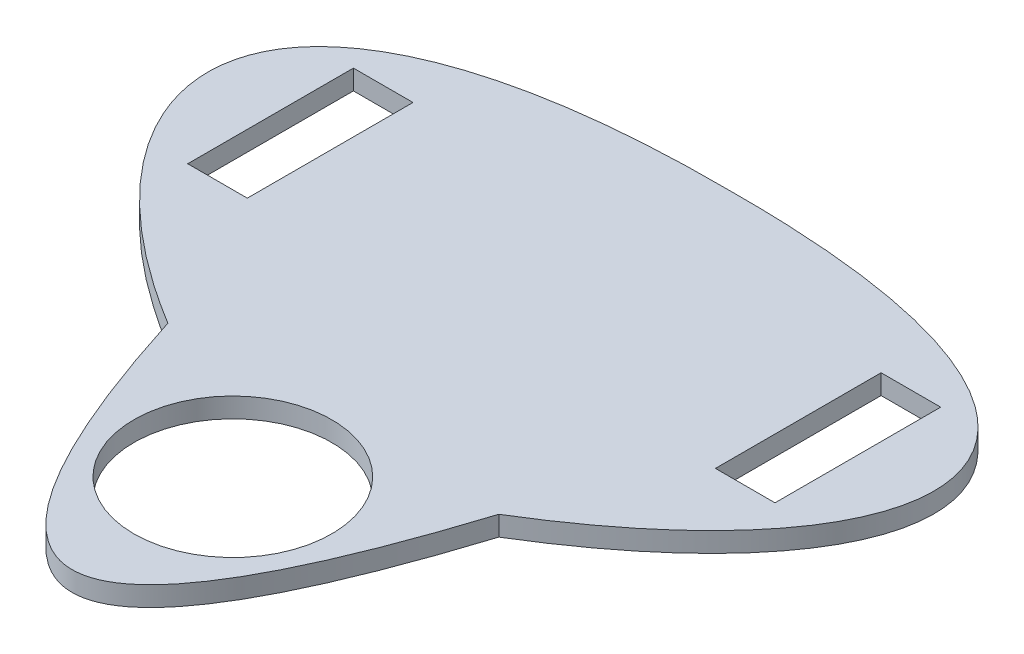
ISO-10303-21;
HEADER;
FILE_DESCRIPTION(('STEP AP214'),'2;1');
FILE_NAME('part.step','',(''),(''),'','','');
FILE_SCHEMA(('AUTOMOTIVE_DESIGN { 1 0 10303 214 1 1 1 1 }'));
ENDSEC;
DATA;
#1=APPLICATION_CONTEXT('core data for automotive mechanical design processes');
#2=APPLICATION_PROTOCOL_DEFINITION('international standard','automotive_design',2000,#1);
#3=PRODUCT_CONTEXT('',#1,'mechanical');
#4=PRODUCT('Part','Part','',(#3));
#5=PRODUCT_RELATED_PRODUCT_CATEGORY('part','',(#4));
#6=PRODUCT_DEFINITION_FORMATION('','',#4);
#7=PRODUCT_DEFINITION_CONTEXT('part definition',#1,'design');
#8=PRODUCT_DEFINITION('design','',#6,#7);
#9=PRODUCT_DEFINITION_SHAPE('','',#8);
#10=(LENGTH_UNIT() NAMED_UNIT(*) SI_UNIT(.MILLI.,.METRE.));
#11=(NAMED_UNIT(*) PLANE_ANGLE_UNIT() SI_UNIT($,.RADIAN.));
#12=(NAMED_UNIT(*) SI_UNIT($,.STERADIAN.) SOLID_ANGLE_UNIT());
#13=UNCERTAINTY_MEASURE_WITH_UNIT(LENGTH_MEASURE(1.E-05),#10,'distance_accuracy_value','');
#14=(GEOMETRIC_REPRESENTATION_CONTEXT(3) GLOBAL_UNCERTAINTY_ASSIGNED_CONTEXT((#13)) GLOBAL_UNIT_ASSIGNED_CONTEXT((#10,
#11,#12)) REPRESENTATION_CONTEXT('',''));
#15=CARTESIAN_POINT('',(0.,0.,0.));
#16=DIRECTION('',(0.,0.,1.));
#17=DIRECTION('',(1.,0.,0.));
#18=AXIS2_PLACEMENT_3D('',#15,#16,#17);
#19=CARTESIAN_POINT('',(-55.3159461520216,3.,-39.9494446301095));
#20=DIRECTION('',(0.,1.,0.));
#21=DIRECTION('',(0.,0.,1.));
#22=AXIS2_PLACEMENT_3D('',#19,#20,#21);
#23=PLANE('',#22);
#24=DIRECTION('',(-1.,0.,0.));
#25=VECTOR('',#24,1.);
#26=CARTESIAN_POINT('',(43.7533411232736,3.,-47.5589863051791));
#27=LINE('',#26,#25);
#28=CARTESIAN_POINT('',(43.7533411232736,3.,-47.5589863051791));
#29=VERTEX_POINT('',#28);
#30=CARTESIAN_POINT('',(34.7195516122944,3.,-47.5589863051791));
#31=VERTEX_POINT('',#30);
#32=EDGE_CURVE('E127',#29,#31,#27,.T.);
#33=ORIENTED_EDGE('',*,*,#32,.F.);
#34=DIRECTION('',(0.,0.,-1.));
#35=VECTOR('',#34,1.);
#36=CARTESIAN_POINT('',(43.7533411232736,3.,-47.5589863051791));
#37=LINE('',#36,#35);
#38=CARTESIAN_POINT('',(43.7533411232736,3.,-22.4410136948209));
#39=VERTEX_POINT('',#38);
#40=EDGE_CURVE('E119',#39,#29,#37,.T.);
#41=ORIENTED_EDGE('',*,*,#40,.F.);
#42=DIRECTION('',(1.,0.,0.));
#43=VECTOR('',#42,1.);
#44=CARTESIAN_POINT('',(43.7533411232736,3.,-22.4410136948209));
#45=LINE('',#44,#43);
#46=CARTESIAN_POINT('',(34.7195516122944,3.,-22.4410136948209));
#47=VERTEX_POINT('',#46);
#48=EDGE_CURVE('E142',#47,#39,#45,.T.);
#49=ORIENTED_EDGE('',*,*,#48,.F.);
#50=DIRECTION('',(0.,0.,1.));
#51=VECTOR('',#50,1.);
#52=CARTESIAN_POINT('',(34.7195516122944,3.,-47.5589863051791));
#53=LINE('',#52,#51);
#54=EDGE_CURVE('E140',#31,#47,#53,.T.);
#55=ORIENTED_EDGE('',*,*,#54,.F.);
#56=EDGE_LOOP('',(#33,#41,#49,#55));
#57=FACE_BOUND('',#56,.T.);
#58=DIRECTION('',(-1.,0.,0.));
#59=VECTOR('',#58,1.);
#60=CARTESIAN_POINT('',(-45.2804483877056,3.,-47.5589863051791));
#61=LINE('',#60,#59);
#62=CARTESIAN_POINT('',(-36.2466588767265,3.,-47.5589863051791));
#63=VERTEX_POINT('',#62);
#64=CARTESIAN_POINT('',(-45.2804483877056,3.,-47.5589863051791));
#65=VERTEX_POINT('',#64);
#66=EDGE_CURVE('E160',#63,#65,#61,.T.);
#67=ORIENTED_EDGE('',*,*,#66,.F.);
#68=DIRECTION('',(0.,0.,-1.));
#69=VECTOR('',#68,1.);
#70=CARTESIAN_POINT('',(-36.2466588767265,3.,-47.5589863051791));
#71=LINE('',#70,#69);
#72=CARTESIAN_POINT('',(-36.2466588767265,3.,-22.4410136948209));
#73=VERTEX_POINT('',#72);
#74=EDGE_CURVE('E158',#73,#63,#71,.T.);
#75=ORIENTED_EDGE('',*,*,#74,.F.);
#76=DIRECTION('',(1.,0.,0.));
#77=VECTOR('',#76,1.);
#78=CARTESIAN_POINT('',(-45.2804483877056,3.,-22.4410136948209));
#79=LINE('',#78,#77);
#80=CARTESIAN_POINT('',(-45.2804483877056,3.,-22.4410136948209));
#81=VERTEX_POINT('',#80);
#82=EDGE_CURVE('E166',#81,#73,#79,.T.);
#83=ORIENTED_EDGE('',*,*,#82,.F.);
#84=DIRECTION('',(0.,0.,1.));
#85=VECTOR('',#84,1.);
#86=CARTESIAN_POINT('',(-45.2804483877056,3.,-47.5589863051791));
#87=LINE('',#86,#85);
#88=EDGE_CURVE('E163',#65,#81,#87,.T.);
#89=ORIENTED_EDGE('',*,*,#88,.F.);
#90=EDGE_LOOP('',(#67,#75,#83,#89));
#91=FACE_BOUND('',#90,.T.);
#92=CARTESIAN_POINT('',(-0.763553632215986,3.,-60.));
#93=CARTESIAN_POINT('',(-69.9674275484428,3.,-60.4820287857416));
#94=CARTESIAN_POINT('',(-68.670488462193,3.,-26.0498235612171));
#95=CARTESIAN_POINT('',(-25.8502675520496,3.,0.));
#96=B_SPLINE_CURVE_WITH_KNOTS('',3,(#92,#93,#94,#95),.UNSPECIFIED.,.F.,.F.,(4,4),(0.,1.),.UNSPECIFIED.);
#97=CARTESIAN_POINT('',(-0.763553632216047,3.,-60.));
#98=VERTEX_POINT('',#97);
#99=CARTESIAN_POINT('',(-25.8502675520496,3.,0.));
#100=VERTEX_POINT('',#99);
#101=EDGE_CURVE('E188',#98,#100,#96,.T.);
#102=ORIENTED_EDGE('',*,*,#101,.T.);
#103=CARTESIAN_POINT('',(-25.8502675520496,3.,0.));
#104=CARTESIAN_POINT('',(-0.763553632216018,3.,79.2351524286827));
#105=CARTESIAN_POINT('',(24.3231602876176,3.,0.));
#106=B_SPLINE_CURVE_WITH_KNOTS('',2,(#103,#104,#105),.UNSPECIFIED.,.F.,.F.,(3,3),(0.,1.),.UNSPECIFIED.);
#107=CARTESIAN_POINT('',(24.3231602876176,3.,0.));
#108=VERTEX_POINT('',#107);
#109=EDGE_CURVE('E194',#100,#108,#106,.T.);
#110=ORIENTED_EDGE('',*,*,#109,.T.);
#111=CARTESIAN_POINT('',(24.3231602876176,3.,0.));
#112=CARTESIAN_POINT('',(67.143381197761,3.,-26.0498235612171));
#113=CARTESIAN_POINT('',(68.4403202840108,3.,-60.4820287857416));
#114=CARTESIAN_POINT('',(-0.763553632216047,3.,-60.));
#115=B_SPLINE_CURVE_WITH_KNOTS('',3,(#111,#112,#113,#114),.UNSPECIFIED.,.F.,.F.,(4,4),(0.,1.),.UNSPECIFIED.);
#116=EDGE_CURVE('E203',#108,#98,#115,.T.);
#117=ORIENTED_EDGE('',*,*,#116,.T.);
#118=EDGE_LOOP('',(#102,#110,#117));
#119=FACE_BOUND('',#118,.T.);
#120=CARTESIAN_POINT('',(-0.763553632216016,3.,15.2373243980552));
#121=DIRECTION('',(0.,1.,0.));
#122=DIRECTION('',(0.,0.,1.));
#123=AXIS2_PLACEMENT_3D('',#120,#121,#122);
#124=CIRCLE('',#123,15.);
#125=CARTESIAN_POINT('',(-0.763553632216016,3.,30.2373243980552));
#126=VERTEX_POINT('',#125);
#127=EDGE_CURVE('E148',#126,#126,#124,.T.);
#128=ORIENTED_EDGE('',*,*,#127,.F.);
#129=EDGE_LOOP('',(#128));
#130=FACE_BOUND('',#129,.T.);
#131=ADVANCED_FACE('F35',(#57,#91,#119,#130),#23,.T.);
#132=CARTESIAN_POINT('',(-55.3159461520216,0.,-39.9494446301095));
#133=DIRECTION('',(0.,1.,0.));
#134=DIRECTION('',(0.,0.,1.));
#135=AXIS2_PLACEMENT_3D('',#132,#133,#134);
#136=PLANE('',#135);
#137=DIRECTION('',(0.,0.,-1.));
#138=VECTOR('',#137,1.);
#139=CARTESIAN_POINT('',(-36.2466588767265,0.,-47.5589863051791));
#140=LINE('',#139,#138);
#141=CARTESIAN_POINT('',(-36.2466588767265,0.,-22.4410136948209));
#142=VERTEX_POINT('',#141);
#143=CARTESIAN_POINT('',(-36.2466588767265,0.,-47.5589863051791));
#144=VERTEX_POINT('',#143);
#145=EDGE_CURVE('E135',#142,#144,#140,.T.);
#146=ORIENTED_EDGE('',*,*,#145,.T.);
#147=DIRECTION('',(-1.,0.,0.));
#148=VECTOR('',#147,1.);
#149=CARTESIAN_POINT('',(-45.2804483877056,0.,-47.5589863051791));
#150=LINE('',#149,#148);
#151=CARTESIAN_POINT('',(-45.2804483877056,0.,-47.5589863051791));
#152=VERTEX_POINT('',#151);
#153=EDGE_CURVE('E171',#144,#152,#150,.T.);
#154=ORIENTED_EDGE('',*,*,#153,.T.);
#155=DIRECTION('',(0.,0.,1.));
#156=VECTOR('',#155,1.);
#157=CARTESIAN_POINT('',(-45.2804483877056,0.,-47.5589863051791));
#158=LINE('',#157,#156);
#159=CARTESIAN_POINT('',(-45.2804483877056,0.,-22.4410136948209));
#160=VERTEX_POINT('',#159);
#161=EDGE_CURVE('E174',#152,#160,#158,.T.);
#162=ORIENTED_EDGE('',*,*,#161,.T.);
#163=DIRECTION('',(1.,0.,0.));
#164=VECTOR('',#163,1.);
#165=CARTESIAN_POINT('',(-45.2804483877056,0.,-22.4410136948209));
#166=LINE('',#165,#164);
#167=EDGE_CURVE('E161',#160,#142,#166,.T.);
#168=ORIENTED_EDGE('',*,*,#167,.T.);
#169=EDGE_LOOP('',(#146,#154,#162,#168));
#170=FACE_BOUND('',#169,.T.);
#171=CARTESIAN_POINT('',(-0.763553632215986,0.,-60.));
#172=CARTESIAN_POINT('',(-69.9674275484428,0.,-60.4820287857416));
#173=CARTESIAN_POINT('',(-68.670488462193,0.,-26.0498235612171));
#174=CARTESIAN_POINT('',(-25.8502675520496,0.,0.));
#175=B_SPLINE_CURVE_WITH_KNOTS('',3,(#171,#172,#173,#174),.UNSPECIFIED.,.F.,.F.,(4,4),(0.,1.),.UNSPECIFIED.);
#176=CARTESIAN_POINT('',(-0.763553632216047,0.,-60.));
#177=VERTEX_POINT('',#176);
#178=CARTESIAN_POINT('',(-25.8502675520496,0.,0.));
#179=VERTEX_POINT('',#178);
#180=EDGE_CURVE('E187',#177,#179,#175,.T.);
#181=ORIENTED_EDGE('',*,*,#180,.F.);
#182=CARTESIAN_POINT('',(24.3231602876176,0.,0.));
#183=CARTESIAN_POINT('',(67.143381197761,0.,-26.0498235612171));
#184=CARTESIAN_POINT('',(68.4403202840108,0.,-60.4820287857416));
#185=CARTESIAN_POINT('',(-0.763553632216047,0.,-60.));
#186=B_SPLINE_CURVE_WITH_KNOTS('',3,(#182,#183,#184,#185),.UNSPECIFIED.,.F.,.F.,(4,4),(0.,1.),.UNSPECIFIED.);
#187=CARTESIAN_POINT('',(24.3231602876176,0.,0.));
#188=VERTEX_POINT('',#187);
#189=EDGE_CURVE('E195',#188,#177,#186,.T.);
#190=ORIENTED_EDGE('',*,*,#189,.F.);
#191=CARTESIAN_POINT('',(-25.8502675520496,0.,0.));
#192=CARTESIAN_POINT('',(-0.763553632216018,0.,79.2351524286827));
#193=CARTESIAN_POINT('',(24.3231602876176,0.,0.));
#194=B_SPLINE_CURVE_WITH_KNOTS('',2,(#191,#192,#193),.UNSPECIFIED.,.F.,.F.,(3,3),(0.,1.),.UNSPECIFIED.);
#195=EDGE_CURVE('E377',#179,#188,#194,.T.);
#196=ORIENTED_EDGE('',*,*,#195,.F.);
#197=EDGE_LOOP('',(#181,#190,#196));
#198=FACE_BOUND('',#197,.T.);
#199=DIRECTION('',(0.,0.,-1.));
#200=VECTOR('',#199,1.);
#201=CARTESIAN_POINT('',(43.7533411232736,0.,-47.5589863051791));
#202=LINE('',#201,#200);
#203=CARTESIAN_POINT('',(43.7533411232736,0.,-22.4410136948209));
#204=VERTEX_POINT('',#203);
#205=CARTESIAN_POINT('',(43.7533411232736,0.,-47.5589863051791));
#206=VERTEX_POINT('',#205);
#207=EDGE_CURVE('E59',#204,#206,#202,.T.);
#208=ORIENTED_EDGE('',*,*,#207,.T.);
#209=DIRECTION('',(-1.,0.,0.));
#210=VECTOR('',#209,1.);
#211=CARTESIAN_POINT('',(43.7533411232736,0.,-47.5589863051791));
#212=LINE('',#211,#210);
#213=CARTESIAN_POINT('',(34.7195516122944,0.,-47.5589863051791));
#214=VERTEX_POINT('',#213);
#215=EDGE_CURVE('E134',#206,#214,#212,.T.);
#216=ORIENTED_EDGE('',*,*,#215,.T.);
#217=DIRECTION('',(0.,0.,1.));
#218=VECTOR('',#217,1.);
#219=CARTESIAN_POINT('',(34.7195516122944,0.,-47.5589863051791));
#220=LINE('',#219,#218);
#221=CARTESIAN_POINT('',(34.7195516122944,0.,-22.4410136948209));
#222=VERTEX_POINT('',#221);
#223=EDGE_CURVE('E150',#214,#222,#220,.T.);
#224=ORIENTED_EDGE('',*,*,#223,.T.);
#225=DIRECTION('',(1.,0.,0.));
#226=VECTOR('',#225,1.);
#227=CARTESIAN_POINT('',(43.7533411232736,0.,-22.4410136948209));
#228=LINE('',#227,#226);
#229=EDGE_CURVE('E128',#222,#204,#228,.T.);
#230=ORIENTED_EDGE('',*,*,#229,.T.);
#231=EDGE_LOOP('',(#208,#216,#224,#230));
#232=FACE_BOUND('',#231,.T.);
#233=CARTESIAN_POINT('',(-0.763553632216016,0.,15.2373243980552));
#234=DIRECTION('',(0.,1.,0.));
#235=DIRECTION('',(0.,0.,1.));
#236=AXIS2_PLACEMENT_3D('',#233,#234,#235);
#237=CIRCLE('',#236,15.);
#238=CARTESIAN_POINT('',(-0.763553632216016,0.,30.2373243980552));
#239=VERTEX_POINT('',#238);
#240=EDGE_CURVE('E262',#239,#239,#237,.T.);
#241=ORIENTED_EDGE('',*,*,#240,.T.);
#242=EDGE_LOOP('',(#241));
#243=FACE_BOUND('',#242,.T.);
#244=ADVANCED_FACE('F220',(#170,#198,#232,#243),#136,.F.);
#245=DIRECTION('',(0.,-1.,0.));
#246=VECTOR('',#245,1.);
#247=SURFACE_OF_LINEAR_EXTRUSION('',#96,#246);
#248=ORIENTED_EDGE('',*,*,#180,.T.);
#249=DIRECTION('',(0.,-1.,0.));
#250=VECTOR('',#249,1.);
#251=CARTESIAN_POINT('',(-25.8502675520496,3.,0.));
#252=LINE('',#251,#250);
#253=EDGE_CURVE('E11',#100,#179,#252,.T.);
#254=ORIENTED_EDGE('',*,*,#253,.F.);
#255=ORIENTED_EDGE('',*,*,#101,.F.);
#256=DIRECTION('',(0.,-1.,0.));
#257=VECTOR('',#256,1.);
#258=CARTESIAN_POINT('',(-0.763553632216047,3.,-60.));
#259=LINE('',#258,#257);
#260=EDGE_CURVE('E374',#98,#177,#259,.T.);
#261=ORIENTED_EDGE('',*,*,#260,.T.);
#262=EDGE_LOOP('',(#248,#254,#255,#261));
#263=FACE_BOUND('',#262,.T.);
#264=ADVANCED_FACE('F37',(#263),#247,.F.);
#265=DIRECTION('',(0.,-1.,0.));
#266=VECTOR('',#265,1.);
#267=SURFACE_OF_LINEAR_EXTRUSION('',#106,#266);
#268=ORIENTED_EDGE('',*,*,#195,.T.);
#269=DIRECTION('',(0.,-1.,0.));
#270=VECTOR('',#269,1.);
#271=CARTESIAN_POINT('',(24.3231602876176,3.,0.));
#272=LINE('',#271,#270);
#273=EDGE_CURVE('E44',#108,#188,#272,.T.);
#274=ORIENTED_EDGE('',*,*,#273,.F.);
#275=ORIENTED_EDGE('',*,*,#109,.F.);
#276=ORIENTED_EDGE('',*,*,#253,.T.);
#277=EDGE_LOOP('',(#268,#274,#275,#276));
#278=FACE_BOUND('',#277,.T.);
#279=ADVANCED_FACE('F211',(#278),#267,.F.);
#280=DIRECTION('',(0.,-1.,0.));
#281=VECTOR('',#280,1.);
#282=SURFACE_OF_LINEAR_EXTRUSION('',#115,#281);
#283=ORIENTED_EDGE('',*,*,#189,.T.);
#284=ORIENTED_EDGE('',*,*,#260,.F.);
#285=ORIENTED_EDGE('',*,*,#116,.F.);
#286=ORIENTED_EDGE('',*,*,#273,.T.);
#287=EDGE_LOOP('',(#283,#284,#285,#286));
#288=FACE_BOUND('',#287,.T.);
#289=ADVANCED_FACE('F214',(#288),#282,.F.);
#290=CARTESIAN_POINT('',(-36.2466588767265,3.,-47.5589863051791));
#291=DIRECTION('',(-1.,0.,0.));
#292=DIRECTION('',(0.,0.,1.));
#293=AXIS2_PLACEMENT_3D('',#290,#291,#292);
#294=PLANE('',#293);
#295=ORIENTED_EDGE('',*,*,#145,.F.);
#296=DIRECTION('',(0.,-1.,0.));
#297=VECTOR('',#296,1.);
#298=CARTESIAN_POINT('',(-36.2466588767265,3.,-22.4410136948209));
#299=LINE('',#298,#297);
#300=EDGE_CURVE('E168',#73,#142,#299,.T.);
#301=ORIENTED_EDGE('',*,*,#300,.F.);
#302=ORIENTED_EDGE('',*,*,#74,.T.);
#303=DIRECTION('',(0.,-1.,0.));
#304=VECTOR('',#303,1.);
#305=CARTESIAN_POINT('',(-36.2466588767265,3.,-47.5589863051791));
#306=LINE('',#305,#304);
#307=EDGE_CURVE('E185',#63,#144,#306,.T.);
#308=ORIENTED_EDGE('',*,*,#307,.T.);
#309=EDGE_LOOP('',(#295,#301,#302,#308));
#310=FACE_BOUND('',#309,.T.);
#311=ADVANCED_FACE('F218',(#310),#294,.T.);
#312=CARTESIAN_POINT('',(-45.2804483877056,3.,-47.5589863051791));
#313=DIRECTION('',(0.,0.,1.));
#314=DIRECTION('',(1.,0.,0.));
#315=AXIS2_PLACEMENT_3D('',#312,#313,#314);
#316=PLANE('',#315);
#317=ORIENTED_EDGE('',*,*,#153,.F.);
#318=ORIENTED_EDGE('',*,*,#307,.F.);
#319=ORIENTED_EDGE('',*,*,#66,.T.);
#320=DIRECTION('',(0.,-1.,0.));
#321=VECTOR('',#320,1.);
#322=CARTESIAN_POINT('',(-45.2804483877056,3.,-47.5589863051791));
#323=LINE('',#322,#321);
#324=EDGE_CURVE('E183',#65,#152,#323,.T.);
#325=ORIENTED_EDGE('',*,*,#324,.T.);
#326=EDGE_LOOP('',(#317,#318,#319,#325));
#327=FACE_BOUND('',#326,.T.);
#328=ADVANCED_FACE('F228',(#327),#316,.T.);
#329=CARTESIAN_POINT('',(-45.2804483877056,3.,-47.5589863051791));
#330=DIRECTION('',(1.,0.,0.));
#331=DIRECTION('',(0.,0.,-1.));
#332=AXIS2_PLACEMENT_3D('',#329,#330,#331);
#333=PLANE('',#332);
#334=ORIENTED_EDGE('',*,*,#161,.F.);
#335=ORIENTED_EDGE('',*,*,#324,.F.);
#336=ORIENTED_EDGE('',*,*,#88,.T.);
#337=DIRECTION('',(0.,-1.,0.));
#338=VECTOR('',#337,1.);
#339=CARTESIAN_POINT('',(-45.2804483877056,3.,-22.4410136948209));
#340=LINE('',#339,#338);
#341=EDGE_CURVE('E181',#81,#160,#340,.T.);
#342=ORIENTED_EDGE('',*,*,#341,.T.);
#343=EDGE_LOOP('',(#334,#335,#336,#342));
#344=FACE_BOUND('',#343,.T.);
#345=ADVANCED_FACE('F232',(#344),#333,.T.);
#346=CARTESIAN_POINT('',(-45.2804483877056,3.,-22.4410136948209));
#347=DIRECTION('',(0.,0.,-1.));
#348=DIRECTION('',(-1.,0.,0.));
#349=AXIS2_PLACEMENT_3D('',#346,#347,#348);
#350=PLANE('',#349);
#351=ORIENTED_EDGE('',*,*,#167,.F.);
#352=ORIENTED_EDGE('',*,*,#341,.F.);
#353=ORIENTED_EDGE('',*,*,#82,.T.);
#354=ORIENTED_EDGE('',*,*,#300,.T.);
#355=EDGE_LOOP('',(#351,#352,#353,#354));
#356=FACE_BOUND('',#355,.T.);
#357=ADVANCED_FACE('F236',(#356),#350,.T.);
#358=CARTESIAN_POINT('',(43.7533411232736,3.,-47.5589863051791));
#359=DIRECTION('',(-1.,0.,0.));
#360=DIRECTION('',(0.,0.,1.));
#361=AXIS2_PLACEMENT_3D('',#358,#359,#360);
#362=PLANE('',#361);
#363=ORIENTED_EDGE('',*,*,#207,.F.);
#364=DIRECTION('',(0.,-1.,0.));
#365=VECTOR('',#364,1.);
#366=CARTESIAN_POINT('',(43.7533411232736,3.,-22.4410136948209));
#367=LINE('',#366,#365);
#368=EDGE_CURVE('E123',#39,#204,#367,.T.);
#369=ORIENTED_EDGE('',*,*,#368,.F.);
#370=ORIENTED_EDGE('',*,*,#40,.T.);
#371=DIRECTION('',(0.,-1.,0.));
#372=VECTOR('',#371,1.);
#373=CARTESIAN_POINT('',(43.7533411232736,3.,-47.5589863051791));
#374=LINE('',#373,#372);
#375=EDGE_CURVE('E122',#29,#206,#374,.T.);
#376=ORIENTED_EDGE('',*,*,#375,.T.);
#377=EDGE_LOOP('',(#363,#369,#370,#376));
#378=FACE_BOUND('',#377,.T.);
#379=ADVANCED_FACE('F121',(#378),#362,.T.);
#380=CARTESIAN_POINT('',(43.7533411232736,3.,-47.5589863051791));
#381=DIRECTION('',(0.,0.,1.));
#382=DIRECTION('',(1.,0.,0.));
#383=AXIS2_PLACEMENT_3D('',#380,#381,#382);
#384=PLANE('',#383);
#385=ORIENTED_EDGE('',*,*,#215,.F.);
#386=ORIENTED_EDGE('',*,*,#375,.F.);
#387=ORIENTED_EDGE('',*,*,#32,.T.);
#388=DIRECTION('',(0.,-1.,0.));
#389=VECTOR('',#388,1.);
#390=CARTESIAN_POINT('',(34.7195516122944,3.,-47.5589863051791));
#391=LINE('',#390,#389);
#392=EDGE_CURVE('E136',#31,#214,#391,.T.);
#393=ORIENTED_EDGE('',*,*,#392,.T.);
#394=EDGE_LOOP('',(#385,#386,#387,#393));
#395=FACE_BOUND('',#394,.T.);
#396=ADVANCED_FACE('F131',(#395),#384,.T.);
#397=CARTESIAN_POINT('',(34.7195516122944,3.,-47.5589863051791));
#398=DIRECTION('',(1.,0.,0.));
#399=DIRECTION('',(0.,0.,-1.));
#400=AXIS2_PLACEMENT_3D('',#397,#398,#399);
#401=PLANE('',#400);
#402=ORIENTED_EDGE('',*,*,#223,.F.);
#403=ORIENTED_EDGE('',*,*,#392,.F.);
#404=ORIENTED_EDGE('',*,*,#54,.T.);
#405=DIRECTION('',(0.,-1.,0.));
#406=VECTOR('',#405,1.);
#407=CARTESIAN_POINT('',(34.7195516122944,3.,-22.4410136948209));
#408=LINE('',#407,#406);
#409=EDGE_CURVE('E51',#47,#222,#408,.T.);
#410=ORIENTED_EDGE('',*,*,#409,.T.);
#411=EDGE_LOOP('',(#402,#403,#404,#410));
#412=FACE_BOUND('',#411,.T.);
#413=ADVANCED_FACE('F245',(#412),#401,.T.);
#414=CARTESIAN_POINT('',(43.7533411232736,3.,-22.4410136948209));
#415=DIRECTION('',(0.,0.,-1.));
#416=DIRECTION('',(-1.,0.,0.));
#417=AXIS2_PLACEMENT_3D('',#414,#415,#416);
#418=PLANE('',#417);
#419=ORIENTED_EDGE('',*,*,#229,.F.);
#420=ORIENTED_EDGE('',*,*,#409,.F.);
#421=ORIENTED_EDGE('',*,*,#48,.T.);
#422=ORIENTED_EDGE('',*,*,#368,.T.);
#423=EDGE_LOOP('',(#419,#420,#421,#422));
#424=FACE_BOUND('',#423,.T.);
#425=ADVANCED_FACE('F248',(#424),#418,.T.);
#426=CARTESIAN_POINT('',(-0.763553632216016,3.,15.2373243980552));
#427=DIRECTION('',(0.,-1.,0.));
#428=DIRECTION('',(0.,0.,-1.));
#429=AXIS2_PLACEMENT_3D('',#426,#427,#428);
#430=CYLINDRICAL_SURFACE('',#429,15.);
#431=ORIENTED_EDGE('',*,*,#127,.T.);
#432=EDGE_LOOP('',(#431));
#433=FACE_BOUND('',#432,.T.);
#434=ORIENTED_EDGE('',*,*,#240,.F.);
#435=EDGE_LOOP('',(#434));
#436=FACE_BOUND('',#435,.T.);
#437=ADVANCED_FACE('F252',(#433,#436),#430,.F.);
#438=CLOSED_SHELL('',(#131,#244,#264,#279,#289,#311,#328,#345,#357,#379,#396,#413,#425,#437));
#439=MANIFOLD_SOLID_BREP('B2',#438);
#440=ADVANCED_BREP_SHAPE_REPRESENTATION('',(#18,#439),#14);
#441=SHAPE_DEFINITION_REPRESENTATION(#9,#440);
ENDSEC;
END-ISO-10303-21;
